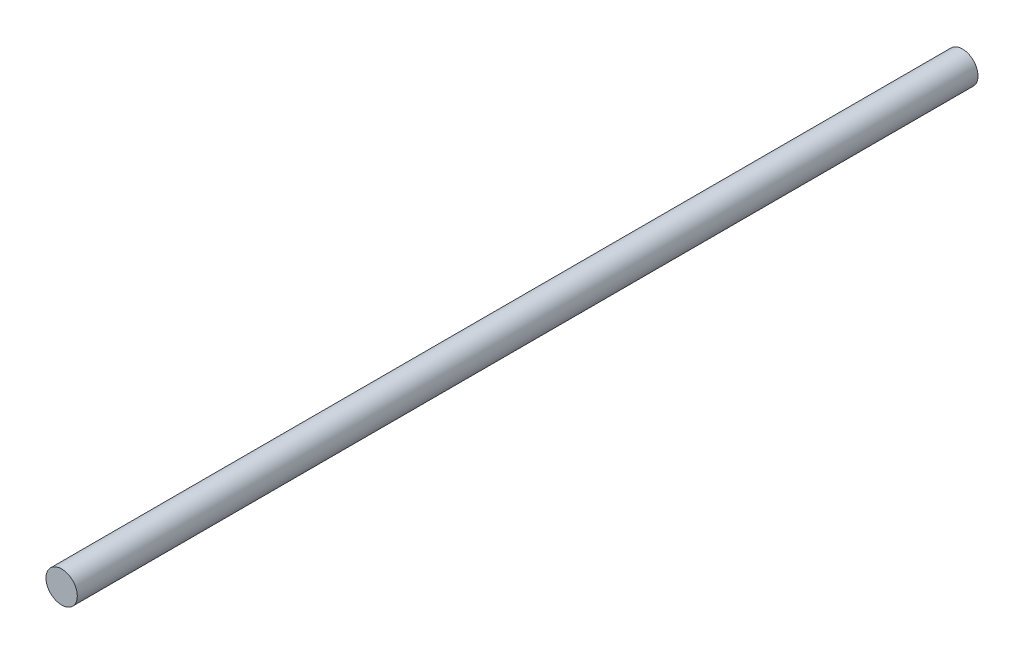
ISO-10303-21;
HEADER;
FILE_DESCRIPTION(('STEP AP214'),'2;1');
FILE_NAME('part.step','',(''),(''),'','','');
FILE_SCHEMA(('AUTOMOTIVE_DESIGN { 1 0 10303 214 1 1 1 1 }'));
ENDSEC;
DATA;
#1=APPLICATION_CONTEXT('core data for automotive mechanical design processes');
#2=APPLICATION_PROTOCOL_DEFINITION('international standard','automotive_design',2000,#1);
#3=PRODUCT_CONTEXT('',#1,'mechanical');
#4=PRODUCT('Part','Part','',(#3));
#5=PRODUCT_RELATED_PRODUCT_CATEGORY('part','',(#4));
#6=PRODUCT_DEFINITION_FORMATION('','',#4);
#7=PRODUCT_DEFINITION_CONTEXT('part definition',#1,'design');
#8=PRODUCT_DEFINITION('design','',#6,#7);
#9=PRODUCT_DEFINITION_SHAPE('','',#8);
#10=(LENGTH_UNIT() NAMED_UNIT(*) SI_UNIT(.MILLI.,.METRE.));
#11=(NAMED_UNIT(*) PLANE_ANGLE_UNIT() SI_UNIT($,.RADIAN.));
#12=(NAMED_UNIT(*) SI_UNIT($,.STERADIAN.) SOLID_ANGLE_UNIT());
#13=UNCERTAINTY_MEASURE_WITH_UNIT(LENGTH_MEASURE(1.E-05),#10,'distance_accuracy_value','');
#14=(GEOMETRIC_REPRESENTATION_CONTEXT(3) GLOBAL_UNCERTAINTY_ASSIGNED_CONTEXT((#13)) GLOBAL_UNIT_ASSIGNED_CONTEXT((#10,
#11,#12)) REPRESENTATION_CONTEXT('',''));
#15=CARTESIAN_POINT('',(0.,0.,0.));
#16=DIRECTION('',(0.,0.,1.));
#17=DIRECTION('',(1.,0.,0.));
#18=AXIS2_PLACEMENT_3D('',#15,#16,#17);
#19=CARTESIAN_POINT('',(0.,0.,115.));
#20=DIRECTION('',(0.,0.,-1.));
#21=DIRECTION('',(-1.,0.,0.));
#22=AXIS2_PLACEMENT_3D('',#19,#20,#21);
#23=CYLINDRICAL_SURFACE('',#22,4.);
#24=CARTESIAN_POINT('',(0.,0.,115.));
#25=DIRECTION('',(0.,0.,1.));
#26=DIRECTION('',(1.,0.,0.));
#27=AXIS2_PLACEMENT_3D('',#24,#25,#26);
#28=CIRCLE('',#27,4.);
#29=CARTESIAN_POINT('',(4.,0.,115.));
#30=VERTEX_POINT('',#29);
#31=EDGE_CURVE('E10',#30,#30,#28,.T.);
#32=ORIENTED_EDGE('',*,*,#31,.F.);
#33=EDGE_LOOP('',(#32));
#34=FACE_BOUND('',#33,.T.);
#35=CARTESIAN_POINT('',(0.,0.,-115.));
#36=DIRECTION('',(0.,0.,1.));
#37=DIRECTION('',(1.,0.,0.));
#38=AXIS2_PLACEMENT_3D('',#35,#36,#37);
#39=CIRCLE('',#38,4.);
#40=CARTESIAN_POINT('',(4.,0.,-115.));
#41=VERTEX_POINT('',#40);
#42=EDGE_CURVE('E36',#41,#41,#39,.T.);
#43=ORIENTED_EDGE('',*,*,#42,.T.);
#44=EDGE_LOOP('',(#43));
#45=FACE_BOUND('',#44,.T.);
#46=ADVANCED_FACE('F33',(#34,#45),#23,.T.);
#47=CARTESIAN_POINT('',(0.,0.,115.));
#48=DIRECTION('',(0.,0.,1.));
#49=DIRECTION('',(1.,0.,0.));
#50=AXIS2_PLACEMENT_3D('',#47,#48,#49);
#51=PLANE('',#50);
#52=ORIENTED_EDGE('',*,*,#31,.T.);
#53=EDGE_LOOP('',(#52));
#54=FACE_BOUND('',#53,.T.);
#55=ADVANCED_FACE('F48',(#54),#51,.T.);
#56=CARTESIAN_POINT('',(0.,0.,-115.));
#57=DIRECTION('',(0.,0.,1.));
#58=DIRECTION('',(1.,0.,0.));
#59=AXIS2_PLACEMENT_3D('',#56,#57,#58);
#60=PLANE('',#59);
#61=ORIENTED_EDGE('',*,*,#42,.F.);
#62=EDGE_LOOP('',(#61));
#63=FACE_BOUND('',#62,.T.);
#64=ADVANCED_FACE('F46',(#63),#60,.F.);
#65=CLOSED_SHELL('',(#46,#55,#64));
#66=MANIFOLD_SOLID_BREP('B2',#65);
#67=ADVANCED_BREP_SHAPE_REPRESENTATION('',(#18,#66),#14);
#68=SHAPE_DEFINITION_REPRESENTATION(#9,#67);
ENDSEC;
END-ISO-10303-21;
